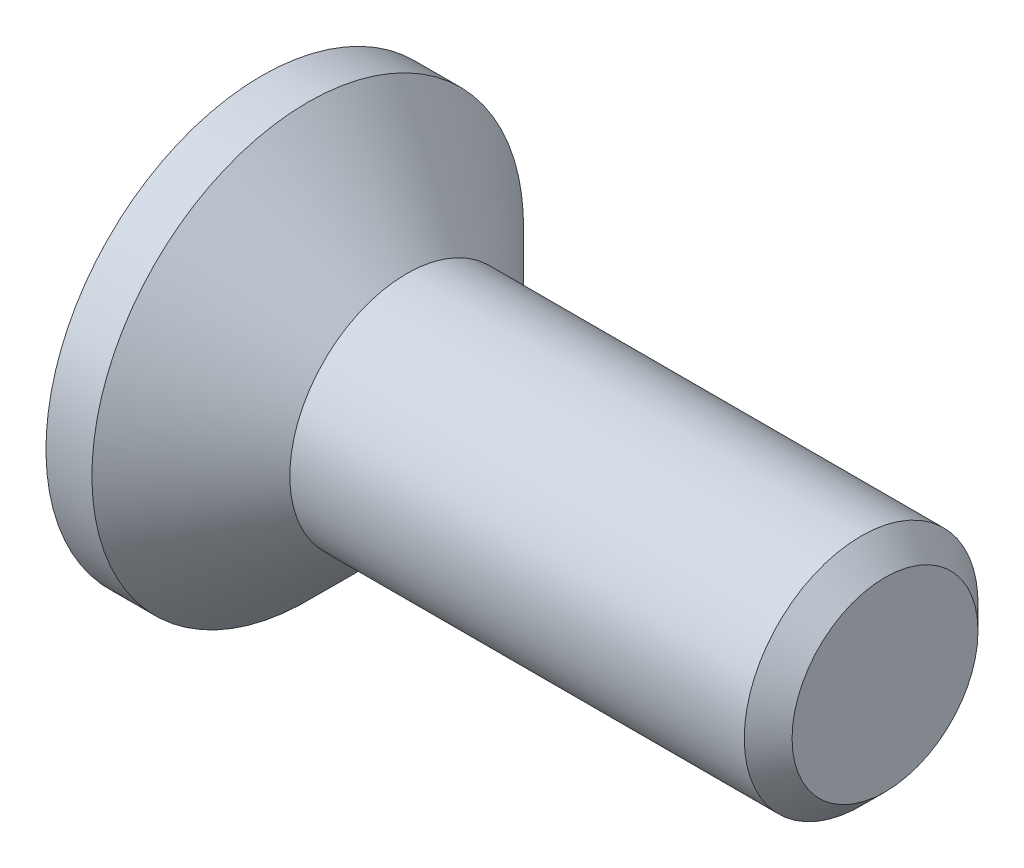
ISO-10303-21;
HEADER;
FILE_DESCRIPTION(('STEP AP214'),'2;1');
FILE_NAME('part.step','',(''),(''),'','','');
FILE_SCHEMA(('AUTOMOTIVE_DESIGN { 1 0 10303 214 1 1 1 1 }'));
ENDSEC;
DATA;
#1=APPLICATION_CONTEXT('core data for automotive mechanical design processes');
#2=APPLICATION_PROTOCOL_DEFINITION('international standard','automotive_design',2000,#1);
#3=PRODUCT_CONTEXT('',#1,'mechanical');
#4=PRODUCT('Part','Part','',(#3));
#5=PRODUCT_RELATED_PRODUCT_CATEGORY('part','',(#4));
#6=PRODUCT_DEFINITION_FORMATION('','',#4);
#7=PRODUCT_DEFINITION_CONTEXT('part definition',#1,'design');
#8=PRODUCT_DEFINITION('design','',#6,#7);
#9=PRODUCT_DEFINITION_SHAPE('','',#8);
#10=(LENGTH_UNIT() NAMED_UNIT(*) SI_UNIT(.MILLI.,.METRE.));
#11=(NAMED_UNIT(*) PLANE_ANGLE_UNIT() SI_UNIT($,.RADIAN.));
#12=(NAMED_UNIT(*) SI_UNIT($,.STERADIAN.) SOLID_ANGLE_UNIT());
#13=UNCERTAINTY_MEASURE_WITH_UNIT(LENGTH_MEASURE(1.E-05),#10,'distance_accuracy_value','');
#14=(GEOMETRIC_REPRESENTATION_CONTEXT(3) GLOBAL_UNCERTAINTY_ASSIGNED_CONTEXT((#13)) GLOBAL_UNIT_ASSIGNED_CONTEXT((#10,
#11,#12)) REPRESENTATION_CONTEXT('',''));
#15=CARTESIAN_POINT('',(0.,0.,0.));
#16=DIRECTION('',(0.,0.,1.));
#17=DIRECTION('',(1.,0.,0.));
#18=AXIS2_PLACEMENT_3D('',#15,#16,#17);
#19=CARTESIAN_POINT('',(1.2959999994564,0.,0.));
#20=DIRECTION('',(-1.,0.,0.));
#21=DIRECTION('',(0.,0.,1.));
#22=AXIS2_PLACEMENT_3D('',#19,#20,#21);
#23=CONICAL_SURFACE('',#22,1.16162874093106,1.04719754966539);
#24=CARTESIAN_POINT('',(1.96666666772671,-2.8421709430404E-10,0.));
#25=VERTEX_POINT('',#24);
#26=VERTEX_LOOP('',#25);
#27=FACE_BOUND('',#26,.T.);
#28=CARTESIAN_POINT('',(1.29999999925257,0.999999999898262,-0.57735026944494));
#29=CARTESIAN_POINT('',(1.3146522266706,0.956056056045472,-0.602721317131627));
#30=CARTESIAN_POINT('',(1.32797766069993,0.91173278873343,-0.628311367393919));
#31=CARTESIAN_POINT('',(1.35123680560414,0.822318826414856,-0.679934542569969));
#32=CARTESIAN_POINT('',(1.36116228917326,0.777226543212464,-0.705968584429191));
#33=CARTESIAN_POINT('',(1.37661201991653,0.687600782861799,-0.757714041303891));
#34=CARTESIAN_POINT('',(1.38223910560156,0.643081091923018,-0.783417496848043));
#35=CARTESIAN_POINT('',(1.38895541533965,0.553832339482309,-0.834945288091916));
#36=CARTESIAN_POINT('',(1.39005020241229,0.509103602152747,-0.860769436630627));
#37=CARTESIAN_POINT('',(1.38776685429575,0.42553275488225,-0.909019087799266));
#38=CARTESIAN_POINT('',(1.3849493567506,0.386678104454639,-0.931451830682708));
#39=CARTESIAN_POINT('',(1.37602134896683,0.309221928974513,-0.976171174446404));
#40=CARTESIAN_POINT('',(1.36990779192312,0.270620671622273,-0.998457620769832));
#41=CARTESIAN_POINT('',(1.35462508259705,0.19300492911636,-1.04326909059902));
#42=CARTESIAN_POINT('',(1.3453911781339,0.154000262326928,-1.06578844546954));
#43=CARTESIAN_POINT('',(1.32443411877448,0.0765725150994032,-1.11049137617407));
#44=CARTESIAN_POINT('',(1.31271588479235,0.0381484434875448,-1.13267552426253));
#45=CARTESIAN_POINT('',(1.29999999914188,1.89128536368614E-10,-1.15470053827006));
#46=B_SPLINE_CURVE_WITH_KNOTS('',3,(#28,#29,#30,#31,#32,#33,#34,#35,#36,#37,#38,#39,#40,#41,#42,
#43,#44,#45),.UNSPECIFIED.,.F.,.F.,(4,2,2,2,2,2,2,2,4),(0.,0.158508005825054,0.317396908613176,
0.472353803206297,0.627120444605972,0.761853891338513,0.896712096786685,1.03456081101147,
1.17213898639974),.UNSPECIFIED.);
#47=CARTESIAN_POINT('',(1.29999999911426,1.,-0.577350269066894));
#48=VERTEX_POINT('',#47);
#49=CARTESIAN_POINT('',(1.29999999914969,0.,-1.15470053825652));
#50=VERTEX_POINT('',#49);
#51=EDGE_CURVE('E81',#48,#50,#46,.T.);
#52=ORIENTED_EDGE('',*,*,#51,.T.);
#53=CARTESIAN_POINT('',(1.29999999925257,-2.71977434289733E-10,-1.1547005384188));
#54=CARTESIAN_POINT('',(1.3146522266706,-0.0439439440156707,-1.12932949054315));
#55=CARTESIAN_POINT('',(1.32797766069993,-0.088267211282957,-1.10373944020334));
#56=CARTESIAN_POINT('',(1.35123680560414,-0.177681173568718,-1.05211626497046));
#57=CARTESIAN_POINT('',(1.36116228917326,-0.222773456783188,-1.02608222313215));
#58=CARTESIAN_POINT('',(1.37661201991653,-0.312399217142442,-0.974336766272332));
#59=CARTESIAN_POINT('',(1.38223910560156,-0.356918908078112,-0.948633310722792));
#60=CARTESIAN_POINT('',(1.38895541533964,-0.446167660516562,-0.897105519475006));
#61=CARTESIAN_POINT('',(1.39005020241229,-0.49089639784697,-0.87128137093776));
#62=CARTESIAN_POINT('',(1.38776685429575,-0.574467245117997,-0.823031719770039));
#63=CARTESIAN_POINT('',(1.3849493567506,-0.613321895545427,-0.800598976886285));
#64=CARTESIAN_POINT('',(1.37602134896683,-0.690778071025421,-0.755879633122358));
#65=CARTESIAN_POINT('',(1.36990779192312,-0.729379328377707,-0.733593186799012));
#66=CARTESIAN_POINT('',(1.35462508259705,-0.806995070883659,-0.688781716969893));
#67=CARTESIAN_POINT('',(1.3453911781339,-0.845999737673081,-0.666262362099358));
#68=CARTESIAN_POINT('',(1.32443411877447,-0.923427484900586,-0.621559431394789));
#69=CARTESIAN_POINT('',(1.31271588479235,-0.961851556512435,-0.599375283306315));
#70=CARTESIAN_POINT('',(1.29999999914188,-0.999999999810871,-0.577350269298821));
#71=B_SPLINE_CURVE_WITH_KNOTS('',3,(#53,#54,#55,#56,#57,#58,#59,#60,#61,#62,#63,#64,#65,#66,#67,
#68,#69,#70),.UNSPECIFIED.,.F.,.F.,(4,2,2,2,2,2,2,2,4),(0.,0.158508005825054,0.317396908613176,
0.472353803206298,0.627120444605972,0.761853891338513,0.896712096786685,1.03456081101147,
1.17213898639974),.UNSPECIFIED.);
#72=CARTESIAN_POINT('',(1.29999999914969,-0.999999999893711,-0.577350269128261));
#73=VERTEX_POINT('',#72);
#74=EDGE_CURVE('E83',#50,#73,#71,.T.);
#75=ORIENTED_EDGE('',*,*,#74,.T.);
#76=CARTESIAN_POINT('',(1.29999999925257,-1.00000000017024,-0.577350268973862));
#77=CARTESIAN_POINT('',(1.3146522266706,-1.00000000006114,-0.526608173411525));
#78=CARTESIAN_POINT('',(1.32797766069993,-1.00000000001639,-0.475428072809423));
#79=CARTESIAN_POINT('',(1.35123680560414,-0.999999999983573,-0.372181722400488));
#80=CARTESIAN_POINT('',(1.36116228917326,-0.999999999995651,-0.320113638702963));
#81=CARTESIAN_POINT('',(1.37661201991653,-1.00000000000424,-0.216622724968441));
#82=CARTESIAN_POINT('',(1.38223910560156,-1.00000000000113,-0.165215813874749));
#83=CARTESIAN_POINT('',(1.38895541533964,-0.999999999998871,-0.0621602313830905));
#84=CARTESIAN_POINT('',(1.39005020241229,-0.999999999999717,-0.0105119343071325));
#85=CARTESIAN_POINT('',(1.38776685429575,-1.00000000000025,0.085987368029227));
#86=CARTESIAN_POINT('',(1.3849493567506,-1.00000000000007,0.130852853796423));
#87=CARTESIAN_POINT('',(1.37602134896683,-0.999999999999933,0.220291541324046));
#88=CARTESIAN_POINT('',(1.36990779192312,-0.999999999999981,0.26486443397082));
#89=CARTESIAN_POINT('',(1.35462508259705,-1.00000000000002,0.354487373629125));
#90=CARTESIAN_POINT('',(1.3453911781339,-1.00000000000001,0.39952608337018));
#91=CARTESIAN_POINT('',(1.32443411877448,-0.99999999999999,0.488931944779284));
#92=CARTESIAN_POINT('',(1.31271588479235,-0.99999999999998,0.533300240956215));
#93=CARTESIAN_POINT('',(1.29999999914188,-1.,0.577350268971238));
#94=B_SPLINE_CURVE_WITH_KNOTS('',3,(#76,#77,#78,#79,#80,#81,#82,#83,#84,#85,#86,#87,#88,#89,#90,
#91,#92,#93),.UNSPECIFIED.,.F.,.F.,(4,2,2,2,2,2,2,2,4),(0.,0.158508005825054,0.317396908613177,
0.472353803206298,0.627120444605972,0.761853891338514,0.896712096786686,1.03456081101148,
1.17213898639974),.UNSPECIFIED.);
#95=CARTESIAN_POINT('',(1.29999999914969,-0.999999999893711,0.577350269128259));
#96=VERTEX_POINT('',#95);
#97=EDGE_CURVE('E104',#73,#96,#94,.T.);
#98=ORIENTED_EDGE('',*,*,#97,.T.);
#99=CARTESIAN_POINT('',(1.29999999925257,-0.999999999898263,0.577350269444939));
#100=CARTESIAN_POINT('',(1.3146522266706,-0.956056056045473,0.602721317131627));
#101=CARTESIAN_POINT('',(1.32797766069993,-0.911732788733431,0.628311367393919));
#102=CARTESIAN_POINT('',(1.35123680560414,-0.822318826414857,0.679934542569969));
#103=CARTESIAN_POINT('',(1.36116228917326,-0.777226543212465,0.705968584429191));
#104=CARTESIAN_POINT('',(1.37661201991653,-0.6876007828618,0.757714041303891));
#105=CARTESIAN_POINT('',(1.38223910560156,-0.643081091923019,0.783417496848044));
#106=CARTESIAN_POINT('',(1.38895541533964,-0.55383233948231,0.834945288091916));
#107=CARTESIAN_POINT('',(1.39005020241229,-0.509103602152748,0.860769436630627));
#108=CARTESIAN_POINT('',(1.38776685429575,-0.42553275488225,0.909019087799266));
#109=CARTESIAN_POINT('',(1.3849493567506,-0.38667810445464,0.931451830682708));
#110=CARTESIAN_POINT('',(1.37602134896683,-0.309221928974513,0.976171174446404));
#111=CARTESIAN_POINT('',(1.36990779192312,-0.270620671622274,0.998457620769832));
#112=CARTESIAN_POINT('',(1.35462508259705,-0.193004929116361,1.04326909059902));
#113=CARTESIAN_POINT('',(1.3453911781339,-0.154000262326929,1.06578844546954));
#114=CARTESIAN_POINT('',(1.32443411877447,-0.0765725150994038,1.11049137617407));
#115=CARTESIAN_POINT('',(1.31271588479235,-0.0381484434875452,1.13267552426253));
#116=CARTESIAN_POINT('',(1.29999999914188,-1.89128893166971E-10,1.15470053827006));
#117=B_SPLINE_CURVE_WITH_KNOTS('',3,(#99,#100,#101,#102,#103,#104,#105,#106,#107,#108,#109,#110,
#111,#112,#113,#114,#115,#116),.UNSPECIFIED.,.F.,.F.,(4,2,2,2,2,2,2,2,4),(0.,0.158508005825054,
0.317396908613176,0.472353803206298,0.627120444605972,0.761853891338514,0.896712096786686,
1.03456081101148,1.17213898639974),.UNSPECIFIED.);
#118=CARTESIAN_POINT('',(1.29999999914969,0.,1.15470053825652));
#119=VERTEX_POINT('',#118);
#120=EDGE_CURVE('E109',#96,#119,#117,.T.);
#121=ORIENTED_EDGE('',*,*,#120,.T.);
#122=CARTESIAN_POINT('',(1.29999999925257,2.71976918982445E-10,1.1547005384188));
#123=CARTESIAN_POINT('',(1.3146522266706,0.0439439440156702,1.12932949054315));
#124=CARTESIAN_POINT('',(1.32797766069993,0.0882672112829566,1.10373944020334));
#125=CARTESIAN_POINT('',(1.35123680560414,0.177681173568717,1.05211626497046));
#126=CARTESIAN_POINT('',(1.36116228917326,0.222773456783187,1.02608222313215));
#127=CARTESIAN_POINT('',(1.37661201991653,0.312399217142441,0.974336766272332));
#128=CARTESIAN_POINT('',(1.38223910560156,0.356918908078112,0.948633310722792));
#129=CARTESIAN_POINT('',(1.38895541533964,0.446167660516561,0.897105519475006));
#130=CARTESIAN_POINT('',(1.39005020241229,0.490896397846969,0.871281370937759));
#131=CARTESIAN_POINT('',(1.38776685429575,0.574467245117996,0.823031719770038));
#132=CARTESIAN_POINT('',(1.3849493567506,0.613321895545427,0.800598976886284));
#133=CARTESIAN_POINT('',(1.37602134896683,0.69077807102542,0.755879633122358));
#134=CARTESIAN_POINT('',(1.36990779192312,0.729379328377707,0.733593186799011));
#135=CARTESIAN_POINT('',(1.35462508259705,0.806995070883658,0.688781716969892));
#136=CARTESIAN_POINT('',(1.3453911781339,0.84599973767308,0.666262362099356));
#137=CARTESIAN_POINT('',(1.32443411877448,0.923427484900586,0.621559431394787));
#138=CARTESIAN_POINT('',(1.31271588479235,0.961851556512435,0.599375283306313));
#139=CARTESIAN_POINT('',(1.29999999914188,0.999999999810871,0.577350269298819));
#140=B_SPLINE_CURVE_WITH_KNOTS('',3,(#122,#123,#124,#125,#126,#127,#128,#129,#130,#131,#132,
#133,#134,#135,#136,#137,#138,#139),.UNSPECIFIED.,.F.,.F.,(4,2,2,2,2,2,2,2,4),(0.,
0.158508005825054,0.317396908613177,0.472353803206298,0.627120444605972,0.761853891338513,
0.896712096786685,1.03456081101147,1.17213898639974),.UNSPECIFIED.);
#141=CARTESIAN_POINT('',(1.29999999914969,0.999999999893711,0.577350269128259));
#142=VERTEX_POINT('',#141);
#143=EDGE_CURVE('E114',#119,#142,#140,.T.);
#144=ORIENTED_EDGE('',*,*,#143,.T.);
#145=CARTESIAN_POINT('',(1.29999999925257,1.00000000017024,0.577350268973861));
#146=CARTESIAN_POINT('',(1.3146522266706,1.00000000006114,0.526608173411524));
#147=CARTESIAN_POINT('',(1.32797766069993,1.00000000001639,0.475428072809422));
#148=CARTESIAN_POINT('',(1.35123680560414,0.999999999983573,0.372181722400487));
#149=CARTESIAN_POINT('',(1.36116228917326,0.999999999995651,0.320113638702962));
#150=CARTESIAN_POINT('',(1.37661201991653,1.00000000000424,0.21662272496844));
#151=CARTESIAN_POINT('',(1.38223910560156,1.00000000000113,0.165215813874748));
#152=CARTESIAN_POINT('',(1.38895541533964,0.999999999998871,0.0621602313830894));
#153=CARTESIAN_POINT('',(1.39005020241229,0.999999999999717,0.0105119343071315));
#154=CARTESIAN_POINT('',(1.38776685429575,1.00000000000025,-0.0859873680292281));
#155=CARTESIAN_POINT('',(1.3849493567506,1.00000000000007,-0.130852853796424));
#156=CARTESIAN_POINT('',(1.37602134896683,0.999999999999933,-0.220291541324047));
#157=CARTESIAN_POINT('',(1.36990779192312,0.999999999999981,-0.264864433970821));
#158=CARTESIAN_POINT('',(1.35462508259705,1.00000000000002,-0.354487373629126));
#159=CARTESIAN_POINT('',(1.3453911781339,1.00000000000001,-0.399526083370181));
#160=CARTESIAN_POINT('',(1.32443411877447,0.99999999999999,-0.488931944779286));
#161=CARTESIAN_POINT('',(1.31271588479235,0.99999999999998,-0.533300240956216));
#162=CARTESIAN_POINT('',(1.29999999914188,1.,-0.577350268971239));
#163=B_SPLINE_CURVE_WITH_KNOTS('',3,(#145,#146,#147,#148,#149,#150,#151,#152,#153,#154,#155,
#156,#157,#158,#159,#160,#161,#162),.UNSPECIFIED.,.F.,.F.,(4,2,2,2,2,2,2,2,4),(0.,
0.158508005825054,0.317396908613177,0.472353803206298,0.627120444605972,0.761853891338514,
0.896712096786686,1.03456081101148,1.17213898639974),.UNSPECIFIED.);
#164=EDGE_CURVE('E21',#142,#48,#163,.T.);
#165=ORIENTED_EDGE('',*,*,#164,.T.);
#166=EDGE_LOOP('',(#52,#75,#98,#121,#144,#165));
#167=FACE_BOUND('',#166,.T.);
#168=ADVANCED_FACE('F17',(#27,#167),#23,.F.);
#169=CARTESIAN_POINT('',(0.,1.,0.577350269189625));
#170=DIRECTION('',(0.,1.,0.));
#171=DIRECTION('',(0.,0.,1.));
#172=AXIS2_PLACEMENT_3D('',#169,#170,#171);
#173=PLANE('',#172);
#174=DIRECTION('',(1.,0.,0.));
#175=VECTOR('',#174,1.);
#176=CARTESIAN_POINT('',(0.,0.999999999999999,0.577350269189625));
#177=LINE('',#176,#175);
#178=CARTESIAN_POINT('',(0.,0.999999999999999,0.577350269189625));
#179=VERTEX_POINT('',#178);
#180=EDGE_CURVE('E117',#142,#179,#177,.F.);
#181=ORIENTED_EDGE('',*,*,#180,.T.);
#182=DIRECTION('',(0.,0.,1.));
#183=VECTOR('',#182,1.);
#184=CARTESIAN_POINT('',(0.,0.999999999999999,0.));
#185=LINE('',#184,#183);
#186=CARTESIAN_POINT('',(0.,0.999999999999999,-0.577350269189626));
#187=VERTEX_POINT('',#186);
#188=EDGE_CURVE('E87',#187,#179,#185,.T.);
#189=ORIENTED_EDGE('',*,*,#188,.F.);
#190=DIRECTION('',(1.,0.,0.));
#191=VECTOR('',#190,1.);
#192=CARTESIAN_POINT('',(0.,0.999999999999999,-0.577350269189626));
#193=LINE('',#192,#191);
#194=EDGE_CURVE('E88',#187,#48,#193,.T.);
#195=ORIENTED_EDGE('',*,*,#194,.T.);
#196=ORIENTED_EDGE('',*,*,#164,.F.);
#197=EDGE_LOOP('',(#181,#189,#195,#196));
#198=FACE_BOUND('',#197,.T.);
#199=ADVANCED_FACE('F77',(#198),#173,.F.);
#200=CARTESIAN_POINT('',(0.,0.,1.15470053837925));
#201=DIRECTION('',(0.,0.500000000000001,0.866025403784438));
#202=DIRECTION('',(0.,-0.866025403784438,0.500000000000001));
#203=AXIS2_PLACEMENT_3D('',#200,#201,#202);
#204=PLANE('',#203);
#205=DIRECTION('',(1.,0.,0.));
#206=VECTOR('',#205,1.);
#207=CARTESIAN_POINT('',(0.,0.,1.15470053837925));
#208=LINE('',#207,#206);
#209=CARTESIAN_POINT('',(0.,0.,1.15470053837925));
#210=VERTEX_POINT('',#209);
#211=EDGE_CURVE('E112',#119,#210,#208,.F.);
#212=ORIENTED_EDGE('',*,*,#211,.T.);
#213=DIRECTION('',(0.,-0.866025403784438,0.500000000000001));
#214=VECTOR('',#213,1.);
#215=CARTESIAN_POINT('',(0.,1.,0.577350269189625));
#216=LINE('',#215,#214);
#217=EDGE_CURVE('E123',#179,#210,#216,.T.);
#218=ORIENTED_EDGE('',*,*,#217,.F.);
#219=ORIENTED_EDGE('',*,*,#180,.F.);
#220=ORIENTED_EDGE('',*,*,#143,.F.);
#221=EDGE_LOOP('',(#212,#218,#219,#220));
#222=FACE_BOUND('',#221,.T.);
#223=ADVANCED_FACE('F190',(#222),#204,.F.);
#224=CARTESIAN_POINT('',(0.,-1.,0.577350269189626));
#225=DIRECTION('',(0.,-0.5,0.866025403784439));
#226=DIRECTION('',(0.,-0.866025403784439,-0.5));
#227=AXIS2_PLACEMENT_3D('',#224,#225,#226);
#228=PLANE('',#227);
#229=DIRECTION('',(1.,0.,0.));
#230=VECTOR('',#229,1.);
#231=CARTESIAN_POINT('',(0.,-1.,0.577350269189625));
#232=LINE('',#231,#230);
#233=CARTESIAN_POINT('',(0.,-1.,0.577350269189625));
#234=VERTEX_POINT('',#233);
#235=EDGE_CURVE('E107',#96,#234,#232,.F.);
#236=ORIENTED_EDGE('',*,*,#235,.T.);
#237=DIRECTION('',(0.,-0.866025403784439,-0.5));
#238=VECTOR('',#237,1.);
#239=CARTESIAN_POINT('',(0.,0.,1.15470053837925));
#240=LINE('',#239,#238);
#241=EDGE_CURVE('E137',#210,#234,#240,.T.);
#242=ORIENTED_EDGE('',*,*,#241,.F.);
#243=ORIENTED_EDGE('',*,*,#211,.F.);
#244=ORIENTED_EDGE('',*,*,#120,.F.);
#245=EDGE_LOOP('',(#236,#242,#243,#244));
#246=FACE_BOUND('',#245,.T.);
#247=ADVANCED_FACE('F175',(#246),#228,.F.);
#248=CARTESIAN_POINT('',(0.,-1.,-0.577350269189626));
#249=DIRECTION('',(0.,-1.,0.));
#250=DIRECTION('',(0.,0.,-1.));
#251=AXIS2_PLACEMENT_3D('',#248,#249,#250);
#252=PLANE('',#251);
#253=DIRECTION('',(1.,0.,0.));
#254=VECTOR('',#253,1.);
#255=CARTESIAN_POINT('',(0.,-1.,-0.577350269189627));
#256=LINE('',#255,#254);
#257=CARTESIAN_POINT('',(0.,-1.,-0.577350269189626));
#258=VERTEX_POINT('',#257);
#259=EDGE_CURVE('E96',#73,#258,#256,.F.);
#260=ORIENTED_EDGE('',*,*,#259,.T.);
#261=DIRECTION('',(0.,0.,1.));
#262=VECTOR('',#261,1.);
#263=CARTESIAN_POINT('',(0.,-1.,0.));
#264=LINE('',#263,#262);
#265=EDGE_CURVE('E132',#234,#258,#264,.F.);
#266=ORIENTED_EDGE('',*,*,#265,.F.);
#267=ORIENTED_EDGE('',*,*,#235,.F.);
#268=ORIENTED_EDGE('',*,*,#97,.F.);
#269=EDGE_LOOP('',(#260,#266,#267,#268));
#270=FACE_BOUND('',#269,.T.);
#271=ADVANCED_FACE('F171',(#270),#252,.F.);
#272=CARTESIAN_POINT('',(0.,0.,-1.15470053837925));
#273=DIRECTION('',(0.,-0.5,-0.866025403784439));
#274=DIRECTION('',(0.,0.866025403784439,-0.5));
#275=AXIS2_PLACEMENT_3D('',#272,#273,#274);
#276=PLANE('',#275);
#277=DIRECTION('',(1.,0.,0.));
#278=VECTOR('',#277,1.);
#279=CARTESIAN_POINT('',(0.,0.,-1.15470053837925));
#280=LINE('',#279,#278);
#281=CARTESIAN_POINT('',(0.,0.,-1.15470053837925));
#282=VERTEX_POINT('',#281);
#283=EDGE_CURVE('E39',#50,#282,#280,.F.);
#284=ORIENTED_EDGE('',*,*,#283,.T.);
#285=DIRECTION('',(0.,0.866025403784439,-0.5));
#286=VECTOR('',#285,1.);
#287=CARTESIAN_POINT('',(0.,-1.,-0.577350269189626));
#288=LINE('',#287,#286);
#289=EDGE_CURVE('E128',#258,#282,#288,.T.);
#290=ORIENTED_EDGE('',*,*,#289,.F.);
#291=ORIENTED_EDGE('',*,*,#259,.F.);
#292=ORIENTED_EDGE('',*,*,#74,.F.);
#293=EDGE_LOOP('',(#284,#290,#291,#292));
#294=FACE_BOUND('',#293,.T.);
#295=ADVANCED_FACE('F166',(#294),#276,.F.);
#296=CARTESIAN_POINT('',(0.,0.999999999999999,-0.577350269189626));
#297=DIRECTION('',(0.,0.5,-0.866025403784439));
#298=DIRECTION('',(0.,0.866025403784439,0.5));
#299=AXIS2_PLACEMENT_3D('',#296,#297,#298);
#300=PLANE('',#299);
#301=ORIENTED_EDGE('',*,*,#194,.F.);
#302=DIRECTION('',(0.,0.866025403784438,0.500000000000001));
#303=VECTOR('',#302,1.);
#304=CARTESIAN_POINT('',(0.,0.,-1.15470053837925));
#305=LINE('',#304,#303);
#306=EDGE_CURVE('E92',#282,#187,#305,.T.);
#307=ORIENTED_EDGE('',*,*,#306,.F.);
#308=ORIENTED_EDGE('',*,*,#283,.F.);
#309=ORIENTED_EDGE('',*,*,#51,.F.);
#310=EDGE_LOOP('',(#301,#307,#308,#309));
#311=FACE_BOUND('',#310,.T.);
#312=ADVANCED_FACE('F90',(#311),#300,.F.);
#313=CARTESIAN_POINT('',(0.,1.96235026918963,0.));
#314=DIRECTION('',(-1.,0.,0.));
#315=DIRECTION('',(0.,0.,1.));
#316=AXIS2_PLACEMENT_3D('',#313,#314,#315);
#317=PLANE('',#316);
#318=ORIENTED_EDGE('',*,*,#289,.T.);
#319=ORIENTED_EDGE('',*,*,#306,.T.);
#320=ORIENTED_EDGE('',*,*,#188,.T.);
#321=ORIENTED_EDGE('',*,*,#217,.T.);
#322=ORIENTED_EDGE('',*,*,#241,.T.);
#323=ORIENTED_EDGE('',*,*,#265,.T.);
#324=EDGE_LOOP('',(#318,#319,#320,#321,#322,#323));
#325=FACE_BOUND('',#324,.T.);
#326=CARTESIAN_POINT('',(0.,0.,0.));
#327=DIRECTION('',(1.,0.,0.));
#328=DIRECTION('',(0.,1.,0.));
#329=AXIS2_PLACEMENT_3D('',#326,#327,#328);
#330=CIRCLE('',#329,2.77000000000001);
#331=CARTESIAN_POINT('',(0.,2.77000000000001,0.));
#332=VERTEX_POINT('',#331);
#333=EDGE_CURVE('E127',#332,#332,#330,.T.);
#334=ORIENTED_EDGE('',*,*,#333,.F.);
#335=EDGE_LOOP('',(#334));
#336=FACE_BOUND('',#335,.T.);
#337=ADVANCED_FACE('F165',(#325,#336),#317,.T.);
#338=CARTESIAN_POINT('',(0.29499999999999,0.,0.));
#339=DIRECTION('',(1.,0.,0.));
#340=DIRECTION('',(0.,1.,0.));
#341=AXIS2_PLACEMENT_3D('',#338,#339,#340);
#342=CYLINDRICAL_SURFACE('',#341,2.77000000000001);
#343=ORIENTED_EDGE('',*,*,#333,.T.);
#344=EDGE_LOOP('',(#343));
#345=FACE_BOUND('',#344,.T.);
#346=CARTESIAN_POINT('',(0.589999999476731,0.,0.));
#347=DIRECTION('',(-1.,0.,0.));
#348=DIRECTION('',(0.,1.,0.));
#349=AXIS2_PLACEMENT_3D('',#346,#347,#348);
#350=CIRCLE('',#349,2.76999999937289);
#351=CARTESIAN_POINT('',(0.589999999476731,2.76999999937289,0.));
#352=VERTEX_POINT('',#351);
#353=EDGE_CURVE('E151',#352,#352,#350,.F.);
#354=ORIENTED_EDGE('',*,*,#353,.F.);
#355=EDGE_LOOP('',(#354));
#356=FACE_BOUND('',#355,.T.);
#357=ADVANCED_FACE('F217',(#345,#356),#342,.T.);
#358=CARTESIAN_POINT('',(8.00000000000001,0.749999999999996,0.));
#359=DIRECTION('',(1.,0.,0.));
#360=DIRECTION('',(0.,0.,-1.));
#361=AXIS2_PLACEMENT_3D('',#358,#359,#360);
#362=PLANE('',#361);
#363=CARTESIAN_POINT('',(8.00000000015189,0.,0.));
#364=DIRECTION('',(-1.,0.,0.));
#365=DIRECTION('',(0.,0.,1.));
#366=AXIS2_PLACEMENT_3D('',#363,#364,#365);
#367=CIRCLE('',#366,1.19327500010513);
#368=CARTESIAN_POINT('',(8.00000000015189,0.,1.19327500010513));
#369=VERTEX_POINT('',#368);
#370=EDGE_CURVE('E148',#369,#369,#367,.T.);
#371=ORIENTED_EDGE('',*,*,#370,.F.);
#372=EDGE_LOOP('',(#371));
#373=FACE_BOUND('',#372,.T.);
#374=ADVANCED_FACE('F214',(#373),#362,.T.);
#375=CARTESIAN_POINT('',(0.589999999476731,0.,0.));
#376=DIRECTION('',(-1.,0.,0.));
#377=DIRECTION('',(0.,0.,1.));
#378=AXIS2_PLACEMENT_3D('',#375,#376,#377);
#379=CONICAL_SURFACE('',#378,2.76999999937289,0.785398162502276);
#380=ORIENTED_EDGE('',*,*,#353,.T.);
#381=EDGE_LOOP('',(#380));
#382=FACE_BOUND('',#381,.T.);
#383=CARTESIAN_POINT('',(1.85999999999999,0.,0.));
#384=DIRECTION('',(1.,0.,0.));
#385=DIRECTION('',(0.,1.,0.));
#386=AXIS2_PLACEMENT_3D('',#383,#384,#385);
#387=CIRCLE('',#386,1.49999999999999);
#388=CARTESIAN_POINT('',(1.85999999999999,1.49999999999999,0.));
#389=VERTEX_POINT('',#388);
#390=EDGE_CURVE('E30',#389,#389,#387,.T.);
#391=ORIENTED_EDGE('',*,*,#390,.F.);
#392=EDGE_LOOP('',(#391));
#393=FACE_BOUND('',#392,.T.);
#394=ADVANCED_FACE('F207',(#382,#393),#379,.T.);
#395=CARTESIAN_POINT('',(7.69327499983774,0.,0.));
#396=DIRECTION('',(-1.,0.,0.));
#397=DIRECTION('',(0.,0.,1.));
#398=AXIS2_PLACEMENT_3D('',#395,#396,#397);
#399=CONICAL_SURFACE('',#398,1.49999999990769,0.785398162563492);
#400=ORIENTED_EDGE('',*,*,#370,.T.);
#401=EDGE_LOOP('',(#400));
#402=FACE_BOUND('',#401,.T.);
#403=CARTESIAN_POINT('',(7.69327500000001,0.,0.));
#404=DIRECTION('',(1.,0.,0.));
#405=DIRECTION('',(0.,1.,0.));
#406=AXIS2_PLACEMENT_3D('',#403,#404,#405);
#407=CIRCLE('',#406,1.49999999999999);
#408=CARTESIAN_POINT('',(7.69327500000001,1.49999999999999,0.));
#409=VERTEX_POINT('',#408);
#410=EDGE_CURVE('E11',#409,#409,#407,.F.);
#411=ORIENTED_EDGE('',*,*,#410,.F.);
#412=EDGE_LOOP('',(#411));
#413=FACE_BOUND('',#412,.T.);
#414=ADVANCED_FACE('F201',(#402,#413),#399,.T.);
#415=CARTESIAN_POINT('',(6.00000000000001,0.,0.));
#416=DIRECTION('',(1.,0.,0.));
#417=DIRECTION('',(0.,1.,0.));
#418=AXIS2_PLACEMENT_3D('',#415,#416,#417);
#419=CYLINDRICAL_SURFACE('',#418,1.49999999999999);
#420=ORIENTED_EDGE('',*,*,#410,.T.);
#421=EDGE_LOOP('',(#420));
#422=FACE_BOUND('',#421,.T.);
#423=ORIENTED_EDGE('',*,*,#390,.T.);
#424=EDGE_LOOP('',(#423));
#425=FACE_BOUND('',#424,.T.);
#426=ADVANCED_FACE('F199',(#422,#425),#419,.T.);
#427=CLOSED_SHELL('',(#168,#199,#223,#247,#271,#295,#312,#337,#357,#374,#394,#414,#426));
#428=MANIFOLD_SOLID_BREP('B1',#427);
#429=ADVANCED_BREP_SHAPE_REPRESENTATION('',(#18,#428),#14);
#430=SHAPE_DEFINITION_REPRESENTATION(#9,#429);
ENDSEC;
END-ISO-10303-21;
